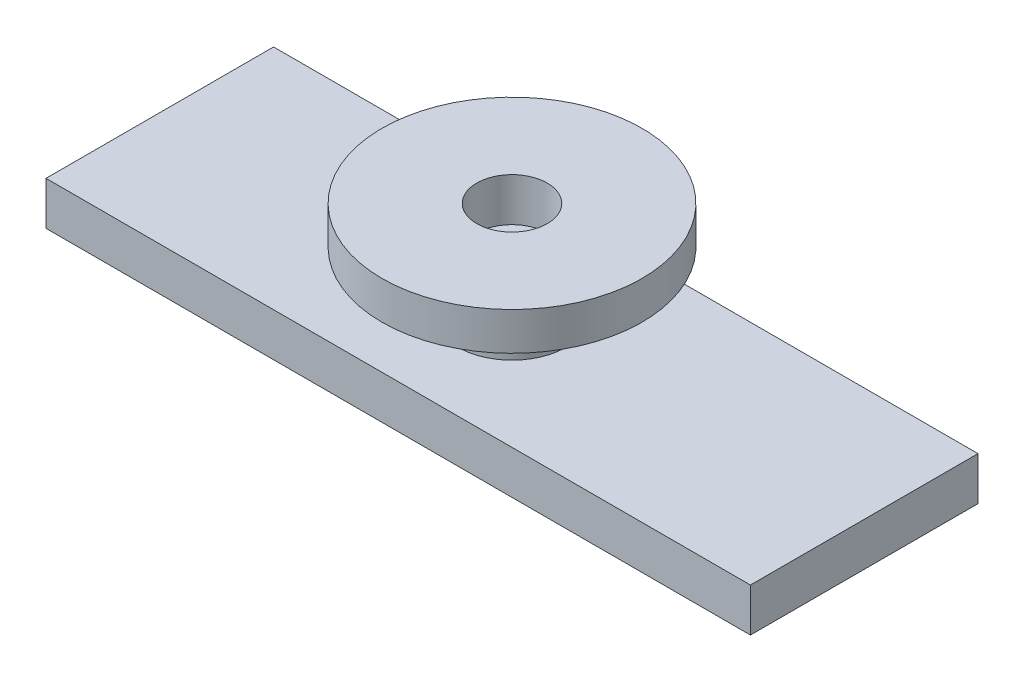
ISO-10303-21;
HEADER;
FILE_DESCRIPTION(('STEP AP214'),'2;1');
FILE_NAME('part.step','',(''),(''),'','','');
FILE_SCHEMA(('AUTOMOTIVE_DESIGN { 1 0 10303 214 1 1 1 1 }'));
ENDSEC;
DATA;
#1=APPLICATION_CONTEXT('core data for automotive mechanical design processes');
#2=APPLICATION_PROTOCOL_DEFINITION('international standard','automotive_design',2000,#1);
#3=PRODUCT_CONTEXT('',#1,'mechanical');
#4=PRODUCT('Part','Part','',(#3));
#5=PRODUCT_RELATED_PRODUCT_CATEGORY('part','',(#4));
#6=PRODUCT_DEFINITION_FORMATION('','',#4);
#7=PRODUCT_DEFINITION_CONTEXT('part definition',#1,'design');
#8=PRODUCT_DEFINITION('design','',#6,#7);
#9=PRODUCT_DEFINITION_SHAPE('','',#8);
#10=(LENGTH_UNIT() NAMED_UNIT(*) SI_UNIT(.MILLI.,.METRE.));
#11=(NAMED_UNIT(*) PLANE_ANGLE_UNIT() SI_UNIT($,.RADIAN.));
#12=(NAMED_UNIT(*) SI_UNIT($,.STERADIAN.) SOLID_ANGLE_UNIT());
#13=UNCERTAINTY_MEASURE_WITH_UNIT(LENGTH_MEASURE(1.E-05),#10,'distance_accuracy_value','');
#14=(GEOMETRIC_REPRESENTATION_CONTEXT(3) GLOBAL_UNCERTAINTY_ASSIGNED_CONTEXT((#13)) GLOBAL_UNIT_ASSIGNED_CONTEXT((#10,
#11,#12)) REPRESENTATION_CONTEXT('',''));
#15=CARTESIAN_POINT('',(0.,0.,0.));
#16=DIRECTION('',(0.,0.,1.));
#17=DIRECTION('',(1.,0.,0.));
#18=AXIS2_PLACEMENT_3D('',#15,#16,#17);
#19=CARTESIAN_POINT('',(-32.5,4.,10.5));
#20=DIRECTION('',(0.,0.,-1.));
#21=DIRECTION('',(-1.,0.,0.));
#22=AXIS2_PLACEMENT_3D('',#19,#20,#21);
#23=PLANE('',#22);
#24=DIRECTION('',(1.,0.,0.));
#25=VECTOR('',#24,1.);
#26=CARTESIAN_POINT('',(-32.5,0.,10.5));
#27=LINE('',#26,#25);
#28=CARTESIAN_POINT('',(-32.5,0.,10.5));
#29=VERTEX_POINT('',#28);
#30=CARTESIAN_POINT('',(32.5,0.,10.5));
#31=VERTEX_POINT('',#30);
#32=EDGE_CURVE('E99',#29,#31,#27,.T.);
#33=ORIENTED_EDGE('',*,*,#32,.T.);
#34=DIRECTION('',(0.,-1.,0.));
#35=VECTOR('',#34,1.);
#36=CARTESIAN_POINT('',(32.5,4.,10.5));
#37=LINE('',#36,#35);
#38=CARTESIAN_POINT('',(32.5,4.,10.5));
#39=VERTEX_POINT('',#38);
#40=EDGE_CURVE('E42',#39,#31,#37,.T.);
#41=ORIENTED_EDGE('',*,*,#40,.F.);
#42=DIRECTION('',(1.,0.,0.));
#43=VECTOR('',#42,1.);
#44=CARTESIAN_POINT('',(-32.5,4.,10.5));
#45=LINE('',#44,#43);
#46=CARTESIAN_POINT('',(-32.5,4.,10.5));
#47=VERTEX_POINT('',#46);
#48=EDGE_CURVE('E74',#47,#39,#45,.T.);
#49=ORIENTED_EDGE('',*,*,#48,.F.);
#50=DIRECTION('',(0.,-1.,0.));
#51=VECTOR('',#50,1.);
#52=CARTESIAN_POINT('',(-32.5,4.,10.5));
#53=LINE('',#52,#51);
#54=EDGE_CURVE('E95',#47,#29,#53,.T.);
#55=ORIENTED_EDGE('',*,*,#54,.T.);
#56=EDGE_LOOP('',(#33,#41,#49,#55));
#57=FACE_BOUND('',#56,.T.);
#58=ADVANCED_FACE('F33',(#57),#23,.F.);
#59=CARTESIAN_POINT('',(32.5,4.,-10.5));
#60=DIRECTION('',(1.,0.,0.));
#61=DIRECTION('',(0.,0.,-1.));
#62=AXIS2_PLACEMENT_3D('',#59,#60,#61);
#63=PLANE('',#62);
#64=DIRECTION('',(0.,0.,1.));
#65=VECTOR('',#64,1.);
#66=CARTESIAN_POINT('',(32.5,0.,-10.5));
#67=LINE('',#66,#65);
#68=CARTESIAN_POINT('',(32.5,0.,-10.5));
#69=VERTEX_POINT('',#68);
#70=EDGE_CURVE('E84',#69,#31,#67,.T.);
#71=ORIENTED_EDGE('',*,*,#70,.F.);
#72=DIRECTION('',(0.,-1.,0.));
#73=VECTOR('',#72,1.);
#74=CARTESIAN_POINT('',(32.5,4.,-10.5));
#75=LINE('',#74,#73);
#76=CARTESIAN_POINT('',(32.5,4.,-10.5));
#77=VERTEX_POINT('',#76);
#78=EDGE_CURVE('E80',#77,#69,#75,.T.);
#79=ORIENTED_EDGE('',*,*,#78,.F.);
#80=DIRECTION('',(0.,0.,1.));
#81=VECTOR('',#80,1.);
#82=CARTESIAN_POINT('',(32.5,4.,-10.5));
#83=LINE('',#82,#81);
#84=EDGE_CURVE('E82',#77,#39,#83,.T.);
#85=ORIENTED_EDGE('',*,*,#84,.T.);
#86=ORIENTED_EDGE('',*,*,#40,.T.);
#87=EDGE_LOOP('',(#71,#79,#85,#86));
#88=FACE_BOUND('',#87,.T.);
#89=ADVANCED_FACE('F81',(#88),#63,.T.);
#90=CARTESIAN_POINT('',(-32.5,4.,-10.5));
#91=DIRECTION('',(0.,0.,-1.));
#92=DIRECTION('',(-1.,0.,0.));
#93=AXIS2_PLACEMENT_3D('',#90,#91,#92);
#94=PLANE('',#93);
#95=DIRECTION('',(1.,0.,0.));
#96=VECTOR('',#95,1.);
#97=CARTESIAN_POINT('',(-32.5,0.,-10.5));
#98=LINE('',#97,#96);
#99=CARTESIAN_POINT('',(-32.5,0.,-10.5));
#100=VERTEX_POINT('',#99);
#101=EDGE_CURVE('E104',#100,#69,#98,.T.);
#102=ORIENTED_EDGE('',*,*,#101,.F.);
#103=DIRECTION('',(0.,-1.,0.));
#104=VECTOR('',#103,1.);
#105=CARTESIAN_POINT('',(-32.5,4.,-10.5));
#106=LINE('',#105,#104);
#107=CARTESIAN_POINT('',(-32.5,4.,-10.5));
#108=VERTEX_POINT('',#107);
#109=EDGE_CURVE('E66',#108,#100,#106,.T.);
#110=ORIENTED_EDGE('',*,*,#109,.F.);
#111=DIRECTION('',(1.,0.,0.));
#112=VECTOR('',#111,1.);
#113=CARTESIAN_POINT('',(-32.5,4.,-10.5));
#114=LINE('',#113,#112);
#115=EDGE_CURVE('E91',#108,#77,#114,.T.);
#116=ORIENTED_EDGE('',*,*,#115,.T.);
#117=ORIENTED_EDGE('',*,*,#78,.T.);
#118=EDGE_LOOP('',(#102,#110,#116,#117));
#119=FACE_BOUND('',#118,.T.);
#120=ADVANCED_FACE('F93',(#119),#94,.T.);
#121=CARTESIAN_POINT('',(-32.5,4.,-10.5));
#122=DIRECTION('',(1.,0.,0.));
#123=DIRECTION('',(0.,0.,-1.));
#124=AXIS2_PLACEMENT_3D('',#121,#122,#123);
#125=PLANE('',#124);
#126=DIRECTION('',(0.,0.,1.));
#127=VECTOR('',#126,1.);
#128=CARTESIAN_POINT('',(-32.5,0.,-10.5));
#129=LINE('',#128,#127);
#130=EDGE_CURVE('E69',#100,#29,#129,.T.);
#131=ORIENTED_EDGE('',*,*,#130,.T.);
#132=ORIENTED_EDGE('',*,*,#54,.F.);
#133=DIRECTION('',(0.,0.,1.));
#134=VECTOR('',#133,1.);
#135=CARTESIAN_POINT('',(-32.5,4.,-10.5));
#136=LINE('',#135,#134);
#137=EDGE_CURVE('E50',#108,#47,#136,.T.);
#138=ORIENTED_EDGE('',*,*,#137,.F.);
#139=ORIENTED_EDGE('',*,*,#109,.T.);
#140=EDGE_LOOP('',(#131,#132,#138,#139));
#141=FACE_BOUND('',#140,.T.);
#142=ADVANCED_FACE('F124',(#141),#125,.F.);
#143=CARTESIAN_POINT('',(0.,4.,0.));
#144=DIRECTION('',(0.,-1.,0.));
#145=DIRECTION('',(0.,0.,-1.));
#146=AXIS2_PLACEMENT_3D('',#143,#144,#145);
#147=PLANE('',#146);
#148=CARTESIAN_POINT('',(0.,4.,0.));
#149=DIRECTION('',(0.,-1.,0.));
#150=DIRECTION('',(0.,0.,-1.));
#151=AXIS2_PLACEMENT_3D('',#148,#149,#150);
#152=CIRCLE('',#151,5.);
#153=CARTESIAN_POINT('',(0.,4.,-5.));
#154=VERTEX_POINT('',#153);
#155=EDGE_CURVE('E11',#154,#154,#152,.F.);
#156=ORIENTED_EDGE('',*,*,#155,.F.);
#157=EDGE_LOOP('',(#156));
#158=FACE_BOUND('',#157,.T.);
#159=ORIENTED_EDGE('',*,*,#48,.T.);
#160=ORIENTED_EDGE('',*,*,#84,.F.);
#161=ORIENTED_EDGE('',*,*,#115,.F.);
#162=ORIENTED_EDGE('',*,*,#137,.T.);
#163=EDGE_LOOP('',(#159,#160,#161,#162));
#164=FACE_BOUND('',#163,.T.);
#165=ADVANCED_FACE('F90',(#158,#164),#147,.F.);
#166=CARTESIAN_POINT('',(0.,0.,0.));
#167=DIRECTION('',(0.,-1.,0.));
#168=DIRECTION('',(0.,0.,-1.));
#169=AXIS2_PLACEMENT_3D('',#166,#167,#168);
#170=PLANE('',#169);
#171=CARTESIAN_POINT('',(0.,0.,0.));
#172=DIRECTION('',(0.,-1.,0.));
#173=DIRECTION('',(0.,0.,-1.));
#174=AXIS2_PLACEMENT_3D('',#171,#172,#173);
#175=CIRCLE('',#174,6.5);
#176=CARTESIAN_POINT('',(0.,0.,-6.5));
#177=VERTEX_POINT('',#176);
#178=EDGE_CURVE('E259',#177,#177,#175,.T.);
#179=ORIENTED_EDGE('',*,*,#178,.F.);
#180=EDGE_LOOP('',(#179));
#181=FACE_BOUND('',#180,.T.);
#182=ORIENTED_EDGE('',*,*,#32,.F.);
#183=ORIENTED_EDGE('',*,*,#130,.F.);
#184=ORIENTED_EDGE('',*,*,#101,.T.);
#185=ORIENTED_EDGE('',*,*,#70,.T.);
#186=EDGE_LOOP('',(#182,#183,#184,#185));
#187=FACE_BOUND('',#186,.T.);
#188=ADVANCED_FACE('F112',(#181,#187),#170,.T.);
#189=CARTESIAN_POINT('',(0.,3.,0.));
#190=DIRECTION('',(0.,-1.,0.));
#191=DIRECTION('',(0.,0.,-1.));
#192=AXIS2_PLACEMENT_3D('',#189,#190,#191);
#193=CYLINDRICAL_SURFACE('',#192,6.5);
#194=CARTESIAN_POINT('',(0.,3.,0.));
#195=DIRECTION('',(0.,-1.,0.));
#196=DIRECTION('',(0.,0.,-1.));
#197=AXIS2_PLACEMENT_3D('',#194,#195,#196);
#198=CIRCLE('',#197,6.5);
#199=CARTESIAN_POINT('',(0.,3.,-6.5));
#200=VERTEX_POINT('',#199);
#201=EDGE_CURVE('E102',#200,#200,#198,.T.);
#202=ORIENTED_EDGE('',*,*,#201,.F.);
#203=EDGE_LOOP('',(#202));
#204=FACE_BOUND('',#203,.T.);
#205=ORIENTED_EDGE('',*,*,#178,.T.);
#206=EDGE_LOOP('',(#205));
#207=FACE_BOUND('',#206,.T.);
#208=ADVANCED_FACE('F114',(#204,#207),#193,.F.);
#209=CARTESIAN_POINT('',(0.,3.,0.));
#210=DIRECTION('',(0.,-1.,0.));
#211=DIRECTION('',(0.,0.,-1.));
#212=AXIS2_PLACEMENT_3D('',#209,#210,#211);
#213=PLANE('',#212);
#214=CARTESIAN_POINT('',(0.,3.,0.));
#215=DIRECTION('',(0.,-1.,0.));
#216=DIRECTION('',(0.,0.,-1.));
#217=AXIS2_PLACEMENT_3D('',#214,#215,#216);
#218=CIRCLE('',#217,3.);
#219=CARTESIAN_POINT('',(0.,3.,-3.));
#220=VERTEX_POINT('',#219);
#221=EDGE_CURVE('E256',#220,#220,#218,.T.);
#222=ORIENTED_EDGE('',*,*,#221,.F.);
#223=EDGE_LOOP('',(#222));
#224=FACE_BOUND('',#223,.T.);
#225=ORIENTED_EDGE('',*,*,#201,.T.);
#226=EDGE_LOOP('',(#225));
#227=FACE_BOUND('',#226,.T.);
#228=ADVANCED_FACE('F121',(#224,#227),#213,.T.);
#229=CARTESIAN_POINT('',(0.,7.,0.));
#230=DIRECTION('',(0.,-1.,0.));
#231=DIRECTION('',(0.,0.,-1.));
#232=AXIS2_PLACEMENT_3D('',#229,#230,#231);
#233=CYLINDRICAL_SURFACE('',#232,3.);
#234=ORIENTED_EDGE('',*,*,#221,.T.);
#235=EDGE_LOOP('',(#234));
#236=FACE_BOUND('',#235,.T.);
#237=CARTESIAN_POINT('',(0.,7.,0.));
#238=DIRECTION('',(0.,-1.,0.));
#239=DIRECTION('',(0.,0.,-1.));
#240=AXIS2_PLACEMENT_3D('',#237,#238,#239);
#241=CIRCLE('',#240,3.);
#242=CARTESIAN_POINT('',(0.,7.,-3.));
#243=VERTEX_POINT('',#242);
#244=EDGE_CURVE('E271',#243,#243,#241,.T.);
#245=ORIENTED_EDGE('',*,*,#244,.F.);
#246=EDGE_LOOP('',(#245));
#247=FACE_BOUND('',#246,.T.);
#248=ADVANCED_FACE('F163',(#236,#247),#233,.F.);
#249=CARTESIAN_POINT('',(0.,9.5,0.));
#250=DIRECTION('',(0.,-1.,0.));
#251=DIRECTION('',(0.,0.,-1.));
#252=AXIS2_PLACEMENT_3D('',#249,#250,#251);
#253=CYLINDRICAL_SURFACE('',#252,5.);
#254=CARTESIAN_POINT('',(0.,9.5,0.));
#255=DIRECTION('',(0.,1.,0.));
#256=DIRECTION('',(0.,0.,1.));
#257=AXIS2_PLACEMENT_3D('',#254,#255,#256);
#258=CIRCLE('',#257,5.);
#259=CARTESIAN_POINT('',(0.,9.5,5.));
#260=VERTEX_POINT('',#259);
#261=EDGE_CURVE('E265',#260,#260,#258,.T.);
#262=ORIENTED_EDGE('',*,*,#261,.F.);
#263=EDGE_LOOP('',(#262));
#264=FACE_BOUND('',#263,.T.);
#265=ORIENTED_EDGE('',*,*,#155,.T.);
#266=EDGE_LOOP('',(#265));
#267=FACE_BOUND('',#266,.T.);
#268=ADVANCED_FACE('F157',(#264,#267),#253,.T.);
#269=CARTESIAN_POINT('',(0.,7.,0.));
#270=DIRECTION('',(0.,-1.,0.));
#271=DIRECTION('',(0.,0.,-1.));
#272=AXIS2_PLACEMENT_3D('',#269,#270,#271);
#273=PLANE('',#272);
#274=CARTESIAN_POINT('',(0.,7.,0.));
#275=DIRECTION('',(0.,-1.,0.));
#276=DIRECTION('',(0.,0.,-1.));
#277=AXIS2_PLACEMENT_3D('',#274,#275,#276);
#278=CIRCLE('',#277,1.5);
#279=CARTESIAN_POINT('',(0.,7.,-1.5));
#280=VERTEX_POINT('',#279);
#281=EDGE_CURVE('E36',#280,#280,#278,.T.);
#282=ORIENTED_EDGE('',*,*,#281,.F.);
#283=EDGE_LOOP('',(#282));
#284=FACE_BOUND('',#283,.T.);
#285=ORIENTED_EDGE('',*,*,#244,.T.);
#286=EDGE_LOOP('',(#285));
#287=FACE_BOUND('',#286,.T.);
#288=ADVANCED_FACE('F162',(#284,#287),#273,.T.);
#289=CARTESIAN_POINT('',(0.,13.,0.));
#290=DIRECTION('',(0.,1.,0.));
#291=DIRECTION('',(0.,0.,1.));
#292=AXIS2_PLACEMENT_3D('',#289,#290,#291);
#293=PLANE('',#292);
#294=CARTESIAN_POINT('',(0.,13.,0.));
#295=DIRECTION('',(0.,1.,0.));
#296=DIRECTION('',(0.,0.,1.));
#297=AXIS2_PLACEMENT_3D('',#294,#295,#296);
#298=CIRCLE('',#297,12.);
#299=CARTESIAN_POINT('',(0.,13.,12.));
#300=VERTEX_POINT('',#299);
#301=EDGE_CURVE('E274',#300,#300,#298,.T.);
#302=ORIENTED_EDGE('',*,*,#301,.T.);
#303=EDGE_LOOP('',(#302));
#304=FACE_BOUND('',#303,.T.);
#305=CARTESIAN_POINT('',(0.,13.,0.));
#306=DIRECTION('',(0.,1.,0.));
#307=DIRECTION('',(0.,0.,1.));
#308=AXIS2_PLACEMENT_3D('',#305,#306,#307);
#309=CIRCLE('',#308,3.25);
#310=CARTESIAN_POINT('',(0.,13.,3.25));
#311=VERTEX_POINT('',#310);
#312=EDGE_CURVE('E278',#311,#311,#309,.T.);
#313=ORIENTED_EDGE('',*,*,#312,.F.);
#314=EDGE_LOOP('',(#313));
#315=FACE_BOUND('',#314,.T.);
#316=ADVANCED_FACE('F183',(#304,#315),#293,.T.);
#317=CARTESIAN_POINT('',(0.,9.5,0.));
#318=DIRECTION('',(0.,1.,0.));
#319=DIRECTION('',(0.,0.,1.));
#320=AXIS2_PLACEMENT_3D('',#317,#318,#319);
#321=PLANE('',#320);
#322=ORIENTED_EDGE('',*,*,#261,.T.);
#323=EDGE_LOOP('',(#322));
#324=FACE_BOUND('',#323,.T.);
#325=CARTESIAN_POINT('',(0.,9.5,0.));
#326=DIRECTION('',(0.,1.,0.));
#327=DIRECTION('',(0.,0.,1.));
#328=AXIS2_PLACEMENT_3D('',#325,#326,#327);
#329=CIRCLE('',#328,12.);
#330=CARTESIAN_POINT('',(0.,9.5,12.));
#331=VERTEX_POINT('',#330);
#332=EDGE_CURVE('E275',#331,#331,#329,.T.);
#333=ORIENTED_EDGE('',*,*,#332,.F.);
#334=EDGE_LOOP('',(#333));
#335=FACE_BOUND('',#334,.T.);
#336=ADVANCED_FACE('F188',(#324,#335),#321,.F.);
#337=CARTESIAN_POINT('',(0.,13.,0.));
#338=DIRECTION('',(0.,-1.,0.));
#339=DIRECTION('',(0.,0.,-1.));
#340=AXIS2_PLACEMENT_3D('',#337,#338,#339);
#341=CYLINDRICAL_SURFACE('',#340,12.);
#342=ORIENTED_EDGE('',*,*,#301,.F.);
#343=EDGE_LOOP('',(#342));
#344=FACE_BOUND('',#343,.T.);
#345=ORIENTED_EDGE('',*,*,#332,.T.);
#346=EDGE_LOOP('',(#345));
#347=FACE_BOUND('',#346,.T.);
#348=ADVANCED_FACE('F198',(#344,#347),#341,.T.);
#349=CARTESIAN_POINT('',(0.,9.,0.));
#350=DIRECTION('',(0.,1.,0.));
#351=DIRECTION('',(0.,0.,1.));
#352=AXIS2_PLACEMENT_3D('',#349,#350,#351);
#353=PLANE('',#352);
#354=CARTESIAN_POINT('',(0.,9.,0.));
#355=DIRECTION('',(0.,1.,0.));
#356=DIRECTION('',(0.,0.,1.));
#357=AXIS2_PLACEMENT_3D('',#354,#355,#356);
#358=CIRCLE('',#357,1.5);
#359=CARTESIAN_POINT('',(0.,9.,1.5));
#360=VERTEX_POINT('',#359);
#361=EDGE_CURVE('E283',#360,#360,#358,.T.);
#362=ORIENTED_EDGE('',*,*,#361,.F.);
#363=EDGE_LOOP('',(#362));
#364=FACE_BOUND('',#363,.T.);
#365=CARTESIAN_POINT('',(0.,9.,0.));
#366=DIRECTION('',(0.,1.,0.));
#367=DIRECTION('',(0.,0.,1.));
#368=AXIS2_PLACEMENT_3D('',#365,#366,#367);
#369=CIRCLE('',#368,3.25);
#370=CARTESIAN_POINT('',(0.,9.,3.25));
#371=VERTEX_POINT('',#370);
#372=EDGE_CURVE('E268',#371,#371,#369,.T.);
#373=ORIENTED_EDGE('',*,*,#372,.T.);
#374=EDGE_LOOP('',(#373));
#375=FACE_BOUND('',#374,.T.);
#376=ADVANCED_FACE('F208',(#364,#375),#353,.T.);
#377=CARTESIAN_POINT('',(0.,9.,0.));
#378=DIRECTION('',(0.,1.,0.));
#379=DIRECTION('',(0.,0.,1.));
#380=AXIS2_PLACEMENT_3D('',#377,#378,#379);
#381=CYLINDRICAL_SURFACE('',#380,3.25);
#382=ORIENTED_EDGE('',*,*,#372,.F.);
#383=EDGE_LOOP('',(#382));
#384=FACE_BOUND('',#383,.T.);
#385=ORIENTED_EDGE('',*,*,#312,.T.);
#386=EDGE_LOOP('',(#385));
#387=FACE_BOUND('',#386,.T.);
#388=ADVANCED_FACE('F216',(#384,#387),#381,.F.);
#389=CARTESIAN_POINT('',(0.,4.,0.));
#390=DIRECTION('',(0.,1.,0.));
#391=DIRECTION('',(0.,0.,1.));
#392=AXIS2_PLACEMENT_3D('',#389,#390,#391);
#393=CYLINDRICAL_SURFACE('',#392,1.5);
#394=ORIENTED_EDGE('',*,*,#281,.T.);
#395=EDGE_LOOP('',(#394));
#396=FACE_BOUND('',#395,.T.);
#397=ORIENTED_EDGE('',*,*,#361,.T.);
#398=EDGE_LOOP('',(#397));
#399=FACE_BOUND('',#398,.T.);
#400=ADVANCED_FACE('F220',(#396,#399),#393,.F.);
#401=CLOSED_SHELL('',(#58,#89,#120,#142,#165,#188,#208,#228,#248,#268,#288,#316,#336,#348,#376,
#388,#400));
#402=MANIFOLD_SOLID_BREP('B2',#401);
#403=ADVANCED_BREP_SHAPE_REPRESENTATION('',(#18,#402),#14);
#404=SHAPE_DEFINITION_REPRESENTATION(#9,#403);
ENDSEC;
END-ISO-10303-21;
